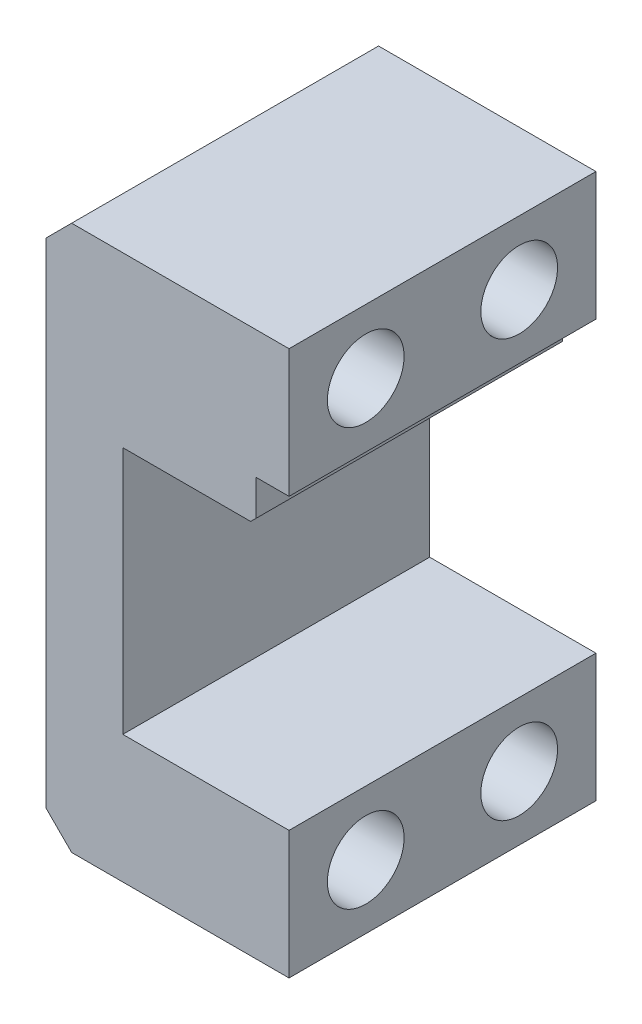
ISO-10303-21;
HEADER;
FILE_DESCRIPTION(('STEP AP214'),'2;1');
FILE_NAME('part.step','',(''),(''),'','','');
FILE_SCHEMA(('AUTOMOTIVE_DESIGN { 1 0 10303 214 1 1 1 1 }'));
ENDSEC;
DATA;
#1=APPLICATION_CONTEXT('core data for automotive mechanical design processes');
#2=APPLICATION_PROTOCOL_DEFINITION('international standard','automotive_design',2000,#1);
#3=PRODUCT_CONTEXT('',#1,'mechanical');
#4=PRODUCT('Part','Part','',(#3));
#5=PRODUCT_RELATED_PRODUCT_CATEGORY('part','',(#4));
#6=PRODUCT_DEFINITION_FORMATION('','',#4);
#7=PRODUCT_DEFINITION_CONTEXT('part definition',#1,'design');
#8=PRODUCT_DEFINITION('design','',#6,#7);
#9=PRODUCT_DEFINITION_SHAPE('','',#8);
#10=(LENGTH_UNIT() NAMED_UNIT(*) SI_UNIT(.MILLI.,.METRE.));
#11=(NAMED_UNIT(*) PLANE_ANGLE_UNIT() SI_UNIT($,.RADIAN.));
#12=(NAMED_UNIT(*) SI_UNIT($,.STERADIAN.) SOLID_ANGLE_UNIT());
#13=UNCERTAINTY_MEASURE_WITH_UNIT(LENGTH_MEASURE(1.E-05),#10,'distance_accuracy_value','');
#14=(GEOMETRIC_REPRESENTATION_CONTEXT(3) GLOBAL_UNCERTAINTY_ASSIGNED_CONTEXT((#13)) GLOBAL_UNIT_ASSIGNED_CONTEXT((#10,
#11,#12)) REPRESENTATION_CONTEXT('',''));
#15=CARTESIAN_POINT('',(0.,0.,0.));
#16=DIRECTION('',(0.,0.,1.));
#17=DIRECTION('',(1.,0.,0.));
#18=AXIS2_PLACEMENT_3D('',#15,#16,#17);
#19=CARTESIAN_POINT('',(9.5,0.,12.));
#20=DIRECTION('',(0.,1.,0.));
#21=DIRECTION('',(-1.,0.,0.));
#22=AXIS2_PLACEMENT_3D('',#19,#20,#21);
#23=PLANE('',#22);
#24=DIRECTION('',(1.,0.,0.));
#25=VECTOR('',#24,1.);
#26=CARTESIAN_POINT('',(9.5,0.,12.));
#27=LINE('',#26,#25);
#28=CARTESIAN_POINT('',(1.,0.,12.));
#29=VERTEX_POINT('',#28);
#30=CARTESIAN_POINT('',(9.5,0.,12.));
#31=VERTEX_POINT('',#30);
#32=EDGE_CURVE('E142',#29,#31,#27,.T.);
#33=ORIENTED_EDGE('',*,*,#32,.F.);
#34=DIRECTION('',(0.,0.,-1.));
#35=VECTOR('',#34,1.);
#36=CARTESIAN_POINT('',(1.,0.,12.));
#37=LINE('',#36,#35);
#38=CARTESIAN_POINT('',(1.,0.,0.));
#39=VERTEX_POINT('',#38);
#40=EDGE_CURVE('E180',#29,#39,#37,.T.);
#41=ORIENTED_EDGE('',*,*,#40,.T.);
#42=DIRECTION('',(1.,0.,0.));
#43=VECTOR('',#42,1.);
#44=CARTESIAN_POINT('',(9.5,0.,0.));
#45=LINE('',#44,#43);
#46=CARTESIAN_POINT('',(9.5,0.,0.));
#47=VERTEX_POINT('',#46);
#48=EDGE_CURVE('E164',#39,#47,#45,.T.);
#49=ORIENTED_EDGE('',*,*,#48,.T.);
#50=DIRECTION('',(0.,0.,-1.));
#51=VECTOR('',#50,1.);
#52=CARTESIAN_POINT('',(9.5,0.,12.));
#53=LINE('',#52,#51);
#54=EDGE_CURVE('E157',#31,#47,#53,.T.);
#55=ORIENTED_EDGE('',*,*,#54,.F.);
#56=EDGE_LOOP('',(#33,#41,#49,#55));
#57=FACE_BOUND('',#56,.T.);
#58=ADVANCED_FACE('F34',(#57),#23,.F.);
#59=CARTESIAN_POINT('',(9.5,5.,12.));
#60=DIRECTION('',(-1.,0.,0.));
#61=DIRECTION('',(0.,-1.,0.));
#62=AXIS2_PLACEMENT_3D('',#59,#60,#61);
#63=PLANE('',#62);
#64=CARTESIAN_POINT('',(9.5,2.5,3.));
#65=DIRECTION('',(-1.,0.,0.));
#66=DIRECTION('',(0.,0.,1.));
#67=AXIS2_PLACEMENT_3D('',#64,#65,#66);
#68=CIRCLE('',#67,1.5);
#69=CARTESIAN_POINT('',(9.5,2.5,4.5));
#70=VERTEX_POINT('',#69);
#71=EDGE_CURVE('E351',#70,#70,#68,.T.);
#72=ORIENTED_EDGE('',*,*,#71,.T.);
#73=EDGE_LOOP('',(#72));
#74=FACE_BOUND('',#73,.T.);
#75=CARTESIAN_POINT('',(9.5,2.5,9.));
#76=DIRECTION('',(-1.,0.,0.));
#77=DIRECTION('',(0.,0.,1.));
#78=AXIS2_PLACEMENT_3D('',#75,#76,#77);
#79=CIRCLE('',#78,1.5);
#80=CARTESIAN_POINT('',(9.5,2.5,10.5));
#81=VERTEX_POINT('',#80);
#82=EDGE_CURVE('E346',#81,#81,#79,.T.);
#83=ORIENTED_EDGE('',*,*,#82,.T.);
#84=EDGE_LOOP('',(#83));
#85=FACE_BOUND('',#84,.T.);
#86=DIRECTION('',(0.,1.,0.));
#87=VECTOR('',#86,1.);
#88=CARTESIAN_POINT('',(9.5,5.,0.));
#89=LINE('',#88,#87);
#90=CARTESIAN_POINT('',(9.5,5.,0.));
#91=VERTEX_POINT('',#90);
#92=EDGE_CURVE('E241',#47,#91,#89,.T.);
#93=ORIENTED_EDGE('',*,*,#92,.T.);
#94=DIRECTION('',(0.,0.,-1.));
#95=VECTOR('',#94,1.);
#96=CARTESIAN_POINT('',(9.5,5.,12.));
#97=LINE('',#96,#95);
#98=CARTESIAN_POINT('',(9.5,5.,12.));
#99=VERTEX_POINT('',#98);
#100=EDGE_CURVE('E159',#99,#91,#97,.T.);
#101=ORIENTED_EDGE('',*,*,#100,.F.);
#102=DIRECTION('',(0.,1.,0.));
#103=VECTOR('',#102,1.);
#104=CARTESIAN_POINT('',(9.5,5.,12.));
#105=LINE('',#104,#103);
#106=EDGE_CURVE('E145',#31,#99,#105,.T.);
#107=ORIENTED_EDGE('',*,*,#106,.F.);
#108=ORIENTED_EDGE('',*,*,#54,.T.);
#109=EDGE_LOOP('',(#93,#101,#107,#108));
#110=FACE_BOUND('',#109,.T.);
#111=ADVANCED_FACE('F156',(#74,#85,#110),#63,.F.);
#112=CARTESIAN_POINT('',(3.,5.,12.));
#113=DIRECTION('',(0.,-1.,0.));
#114=DIRECTION('',(1.,0.,0.));
#115=AXIS2_PLACEMENT_3D('',#112,#113,#114);
#116=PLANE('',#115);
#117=DIRECTION('',(-1.,0.,0.));
#118=VECTOR('',#117,1.);
#119=CARTESIAN_POINT('',(3.,5.,0.));
#120=LINE('',#119,#118);
#121=CARTESIAN_POINT('',(3.,5.,0.));
#122=VERTEX_POINT('',#121);
#123=EDGE_CURVE('E243',#91,#122,#120,.T.);
#124=ORIENTED_EDGE('',*,*,#123,.T.);
#125=DIRECTION('',(0.,0.,-1.));
#126=VECTOR('',#125,1.);
#127=CARTESIAN_POINT('',(3.,5.,12.));
#128=LINE('',#127,#126);
#129=CARTESIAN_POINT('',(3.,5.,12.));
#130=VERTEX_POINT('',#129);
#131=EDGE_CURVE('E171',#130,#122,#128,.T.);
#132=ORIENTED_EDGE('',*,*,#131,.F.);
#133=DIRECTION('',(-1.,0.,0.));
#134=VECTOR('',#133,1.);
#135=CARTESIAN_POINT('',(3.,5.,12.));
#136=LINE('',#135,#134);
#137=EDGE_CURVE('E161',#99,#130,#136,.T.);
#138=ORIENTED_EDGE('',*,*,#137,.F.);
#139=ORIENTED_EDGE('',*,*,#100,.T.);
#140=EDGE_LOOP('',(#124,#132,#138,#139));
#141=FACE_BOUND('',#140,.T.);
#142=ADVANCED_FACE('F320',(#141),#116,.F.);
#143=CARTESIAN_POINT('',(3.,14.71,12.));
#144=DIRECTION('',(-1.,0.,0.));
#145=DIRECTION('',(0.,-1.,0.));
#146=AXIS2_PLACEMENT_3D('',#143,#144,#145);
#147=PLANE('',#146);
#148=DIRECTION('',(0.,1.,0.));
#149=VECTOR('',#148,1.);
#150=CARTESIAN_POINT('',(3.,14.71,0.));
#151=LINE('',#150,#149);
#152=CARTESIAN_POINT('',(3.,14.71,0.));
#153=VERTEX_POINT('',#152);
#154=EDGE_CURVE('E245',#122,#153,#151,.T.);
#155=ORIENTED_EDGE('',*,*,#154,.T.);
#156=DIRECTION('',(0.,0.,-1.));
#157=VECTOR('',#156,1.);
#158=CARTESIAN_POINT('',(3.,14.71,12.));
#159=LINE('',#158,#157);
#160=CARTESIAN_POINT('',(3.,14.71,12.));
#161=VERTEX_POINT('',#160);
#162=EDGE_CURVE('E267',#161,#153,#159,.T.);
#163=ORIENTED_EDGE('',*,*,#162,.F.);
#164=DIRECTION('',(0.,1.,0.));
#165=VECTOR('',#164,1.);
#166=CARTESIAN_POINT('',(3.,14.71,12.));
#167=LINE('',#166,#165);
#168=EDGE_CURVE('E228',#130,#161,#167,.T.);
#169=ORIENTED_EDGE('',*,*,#168,.F.);
#170=ORIENTED_EDGE('',*,*,#131,.T.);
#171=EDGE_LOOP('',(#155,#163,#169,#170));
#172=FACE_BOUND('',#171,.T.);
#173=ADVANCED_FACE('F274',(#172),#147,.F.);
#174=CARTESIAN_POINT('',(8.2,14.71,12.));
#175=DIRECTION('',(0.,1.,0.));
#176=DIRECTION('',(-1.,0.,0.));
#177=AXIS2_PLACEMENT_3D('',#174,#175,#176);
#178=PLANE('',#177);
#179=DIRECTION('',(1.,0.,0.));
#180=VECTOR('',#179,1.);
#181=CARTESIAN_POINT('',(8.2,14.71,0.));
#182=LINE('',#181,#180);
#183=CARTESIAN_POINT('',(8.,14.71,0.));
#184=VERTEX_POINT('',#183);
#185=EDGE_CURVE('E247',#153,#184,#182,.T.);
#186=ORIENTED_EDGE('',*,*,#185,.T.);
#187=DIRECTION('',(0.,0.,1.));
#188=VECTOR('',#187,1.);
#189=CARTESIAN_POINT('',(8.,14.71,12.));
#190=LINE('',#189,#188);
#191=CARTESIAN_POINT('',(8.,14.71,12.));
#192=VERTEX_POINT('',#191);
#193=EDGE_CURVE('E176',#184,#192,#190,.T.);
#194=ORIENTED_EDGE('',*,*,#193,.T.);
#195=DIRECTION('',(1.,0.,0.));
#196=VECTOR('',#195,1.);
#197=CARTESIAN_POINT('',(8.2,14.71,12.));
#198=LINE('',#197,#196);
#199=EDGE_CURVE('E230',#161,#192,#198,.T.);
#200=ORIENTED_EDGE('',*,*,#199,.F.);
#201=ORIENTED_EDGE('',*,*,#162,.T.);
#202=EDGE_LOOP('',(#186,#194,#200,#201));
#203=FACE_BOUND('',#202,.T.);
#204=ADVANCED_FACE('F284',(#203),#178,.F.);
#205=CARTESIAN_POINT('',(8.2,16.31,12.));
#206=DIRECTION('',(-1.,0.,0.));
#207=DIRECTION('',(0.,-1.,0.));
#208=AXIS2_PLACEMENT_3D('',#205,#206,#207);
#209=PLANE('',#208);
#210=DIRECTION('',(0.,1.,0.));
#211=VECTOR('',#210,1.);
#212=CARTESIAN_POINT('',(8.2,16.31,12.));
#213=LINE('',#212,#211);
#214=CARTESIAN_POINT('',(8.2,14.91,12.));
#215=VERTEX_POINT('',#214);
#216=CARTESIAN_POINT('',(8.2,16.31,12.));
#217=VERTEX_POINT('',#216);
#218=EDGE_CURVE('E233',#215,#217,#213,.T.);
#219=ORIENTED_EDGE('',*,*,#218,.F.);
#220=DIRECTION('',(0.,0.,-1.));
#221=VECTOR('',#220,1.);
#222=CARTESIAN_POINT('',(8.2,14.91,12.));
#223=LINE('',#222,#221);
#224=CARTESIAN_POINT('',(8.2,14.91,0.));
#225=VERTEX_POINT('',#224);
#226=EDGE_CURVE('E166',#215,#225,#223,.T.);
#227=ORIENTED_EDGE('',*,*,#226,.T.);
#228=DIRECTION('',(0.,1.,0.));
#229=VECTOR('',#228,1.);
#230=CARTESIAN_POINT('',(8.2,16.31,0.));
#231=LINE('',#230,#229);
#232=CARTESIAN_POINT('',(8.2,16.31,0.));
#233=VERTEX_POINT('',#232);
#234=EDGE_CURVE('E250',#225,#233,#231,.T.);
#235=ORIENTED_EDGE('',*,*,#234,.T.);
#236=DIRECTION('',(0.,0.,-1.));
#237=VECTOR('',#236,1.);
#238=CARTESIAN_POINT('',(8.2,16.31,12.));
#239=LINE('',#238,#237);
#240=EDGE_CURVE('E264',#217,#233,#239,.T.);
#241=ORIENTED_EDGE('',*,*,#240,.F.);
#242=EDGE_LOOP('',(#219,#227,#235,#241));
#243=FACE_BOUND('',#242,.T.);
#244=ADVANCED_FACE('F293',(#243),#209,.F.);
#245=CARTESIAN_POINT('',(9.5,16.31,12.));
#246=DIRECTION('',(0.,1.,0.));
#247=DIRECTION('',(0.,0.,1.));
#248=AXIS2_PLACEMENT_3D('',#245,#246,#247);
#249=PLANE('',#248);
#250=DIRECTION('',(1.,0.,0.));
#251=VECTOR('',#250,1.);
#252=CARTESIAN_POINT('',(9.5,16.31,0.));
#253=LINE('',#252,#251);
#254=CARTESIAN_POINT('',(9.5,16.31,0.));
#255=VERTEX_POINT('',#254);
#256=EDGE_CURVE('E252',#233,#255,#253,.T.);
#257=ORIENTED_EDGE('',*,*,#256,.T.);
#258=DIRECTION('',(0.,0.,-1.));
#259=VECTOR('',#258,1.);
#260=CARTESIAN_POINT('',(9.5,16.31,12.));
#261=LINE('',#260,#259);
#262=CARTESIAN_POINT('',(9.5,16.31,12.));
#263=VERTEX_POINT('',#262);
#264=EDGE_CURVE('E261',#263,#255,#261,.T.);
#265=ORIENTED_EDGE('',*,*,#264,.F.);
#266=DIRECTION('',(1.,0.,0.));
#267=VECTOR('',#266,1.);
#268=CARTESIAN_POINT('',(9.5,16.31,12.));
#269=LINE('',#268,#267);
#270=EDGE_CURVE('E235',#217,#263,#269,.T.);
#271=ORIENTED_EDGE('',*,*,#270,.F.);
#272=ORIENTED_EDGE('',*,*,#240,.T.);
#273=EDGE_LOOP('',(#257,#265,#271,#272));
#274=FACE_BOUND('',#273,.T.);
#275=ADVANCED_FACE('F298',(#274),#249,.F.);
#276=CARTESIAN_POINT('',(9.5,21.31,12.));
#277=DIRECTION('',(-1.,0.,0.));
#278=DIRECTION('',(0.,0.,1.));
#279=AXIS2_PLACEMENT_3D('',#276,#277,#278);
#280=PLANE('',#279);
#281=CARTESIAN_POINT('',(9.5,18.81,9.));
#282=DIRECTION('',(-1.,0.,0.));
#283=DIRECTION('',(0.,0.,1.));
#284=AXIS2_PLACEMENT_3D('',#281,#282,#283);
#285=CIRCLE('',#284,1.5);
#286=CARTESIAN_POINT('',(9.5,18.81,10.5));
#287=VERTEX_POINT('',#286);
#288=EDGE_CURVE('E219',#287,#287,#285,.T.);
#289=ORIENTED_EDGE('',*,*,#288,.T.);
#290=EDGE_LOOP('',(#289));
#291=FACE_BOUND('',#290,.T.);
#292=CARTESIAN_POINT('',(9.5,18.81,3.));
#293=DIRECTION('',(-1.,0.,0.));
#294=DIRECTION('',(0.,0.,1.));
#295=AXIS2_PLACEMENT_3D('',#292,#293,#294);
#296=CIRCLE('',#295,1.5);
#297=CARTESIAN_POINT('',(9.5,18.81,4.5));
#298=VERTEX_POINT('',#297);
#299=EDGE_CURVE('E218',#298,#298,#296,.T.);
#300=ORIENTED_EDGE('',*,*,#299,.T.);
#301=EDGE_LOOP('',(#300));
#302=FACE_BOUND('',#301,.T.);
#303=DIRECTION('',(0.,1.,0.));
#304=VECTOR('',#303,1.);
#305=CARTESIAN_POINT('',(9.5,21.31,0.));
#306=LINE('',#305,#304);
#307=CARTESIAN_POINT('',(9.5,21.31,0.));
#308=VERTEX_POINT('',#307);
#309=EDGE_CURVE('E254',#255,#308,#306,.T.);
#310=ORIENTED_EDGE('',*,*,#309,.T.);
#311=DIRECTION('',(0.,0.,-1.));
#312=VECTOR('',#311,1.);
#313=CARTESIAN_POINT('',(9.5,21.31,12.));
#314=LINE('',#313,#312);
#315=CARTESIAN_POINT('',(9.5,21.31,12.));
#316=VERTEX_POINT('',#315);
#317=EDGE_CURVE('E208',#316,#308,#314,.T.);
#318=ORIENTED_EDGE('',*,*,#317,.F.);
#319=DIRECTION('',(0.,1.,0.));
#320=VECTOR('',#319,1.);
#321=CARTESIAN_POINT('',(9.5,21.31,12.));
#322=LINE('',#321,#320);
#323=EDGE_CURVE('E237',#263,#316,#322,.T.);
#324=ORIENTED_EDGE('',*,*,#323,.F.);
#325=ORIENTED_EDGE('',*,*,#264,.T.);
#326=EDGE_LOOP('',(#310,#318,#324,#325));
#327=FACE_BOUND('',#326,.T.);
#328=ADVANCED_FACE('F302',(#291,#302,#327),#280,.F.);
#329=CARTESIAN_POINT('',(0.,21.31,12.));
#330=DIRECTION('',(0.,-1.,0.));
#331=DIRECTION('',(0.,0.,-1.));
#332=AXIS2_PLACEMENT_3D('',#329,#330,#331);
#333=PLANE('',#332);
#334=DIRECTION('',(-1.,0.,0.));
#335=VECTOR('',#334,1.);
#336=CARTESIAN_POINT('',(0.,21.31,0.));
#337=LINE('',#336,#335);
#338=CARTESIAN_POINT('',(1.00000000000001,21.31,0.));
#339=VERTEX_POINT('',#338);
#340=EDGE_CURVE('E256',#308,#339,#337,.T.);
#341=ORIENTED_EDGE('',*,*,#340,.T.);
#342=DIRECTION('',(0.,0.,1.));
#343=VECTOR('',#342,1.);
#344=CARTESIAN_POINT('',(1.00000000000001,21.31,12.));
#345=LINE('',#344,#343);
#346=CARTESIAN_POINT('',(1.00000000000001,21.31,12.));
#347=VERTEX_POINT('',#346);
#348=EDGE_CURVE('E11',#339,#347,#345,.T.);
#349=ORIENTED_EDGE('',*,*,#348,.T.);
#350=DIRECTION('',(-1.,0.,0.));
#351=VECTOR('',#350,1.);
#352=CARTESIAN_POINT('',(0.,21.31,12.));
#353=LINE('',#352,#351);
#354=EDGE_CURVE('E201',#316,#347,#353,.T.);
#355=ORIENTED_EDGE('',*,*,#354,.F.);
#356=ORIENTED_EDGE('',*,*,#317,.T.);
#357=EDGE_LOOP('',(#341,#349,#355,#356));
#358=FACE_BOUND('',#357,.T.);
#359=ADVANCED_FACE('F305',(#358),#333,.F.);
#360=CARTESIAN_POINT('',(0.,0.,12.));
#361=DIRECTION('',(1.,0.,0.));
#362=DIRECTION('',(0.,0.,-1.));
#363=AXIS2_PLACEMENT_3D('',#360,#361,#362);
#364=PLANE('',#363);
#365=DIRECTION('',(0.,-1.,0.));
#366=VECTOR('',#365,1.);
#367=CARTESIAN_POINT('',(0.,0.,0.));
#368=LINE('',#367,#366);
#369=CARTESIAN_POINT('',(0.,20.31,0.));
#370=VERTEX_POINT('',#369);
#371=CARTESIAN_POINT('',(0.,1.00000000000001,0.));
#372=VERTEX_POINT('',#371);
#373=EDGE_CURVE('E152',#370,#372,#368,.T.);
#374=ORIENTED_EDGE('',*,*,#373,.T.);
#375=DIRECTION('',(0.,0.,1.));
#376=VECTOR('',#375,1.);
#377=CARTESIAN_POINT('',(0.,1.00000000000001,12.));
#378=LINE('',#377,#376);
#379=CARTESIAN_POINT('',(0.,1.00000000000001,3.));
#380=VERTEX_POINT('',#379);
#381=EDGE_CURVE('E196',#372,#380,#378,.T.);
#382=ORIENTED_EDGE('',*,*,#381,.T.);
#383=CARTESIAN_POINT('',(0.,2.5,3.));
#384=DIRECTION('',(-1.,0.,0.));
#385=DIRECTION('',(0.,0.,1.));
#386=AXIS2_PLACEMENT_3D('',#383,#384,#385);
#387=CIRCLE('',#386,1.5);
#388=EDGE_CURVE('E343',#380,#380,#387,.T.);
#389=ORIENTED_EDGE('',*,*,#388,.F.);
#390=DIRECTION('',(0.,0.,1.));
#391=VECTOR('',#390,1.);
#392=CARTESIAN_POINT('',(0.,1.00000000000001,12.));
#393=LINE('',#392,#391);
#394=CARTESIAN_POINT('',(0.,1.00000000000001,9.));
#395=VERTEX_POINT('',#394);
#396=EDGE_CURVE('E194',#380,#395,#393,.T.);
#397=ORIENTED_EDGE('',*,*,#396,.T.);
#398=CARTESIAN_POINT('',(0.,2.5,9.));
#399=DIRECTION('',(-1.,0.,0.));
#400=DIRECTION('',(0.,0.,1.));
#401=AXIS2_PLACEMENT_3D('',#398,#399,#400);
#402=CIRCLE('',#401,1.5);
#403=EDGE_CURVE('E341',#395,#395,#402,.T.);
#404=ORIENTED_EDGE('',*,*,#403,.F.);
#405=DIRECTION('',(0.,0.,1.));
#406=VECTOR('',#405,1.);
#407=CARTESIAN_POINT('',(0.,1.00000000000001,12.));
#408=LINE('',#407,#406);
#409=CARTESIAN_POINT('',(0.,1.00000000000001,12.));
#410=VERTEX_POINT('',#409);
#411=EDGE_CURVE('E55',#395,#410,#408,.T.);
#412=ORIENTED_EDGE('',*,*,#411,.T.);
#413=DIRECTION('',(0.,-1.,0.));
#414=VECTOR('',#413,1.);
#415=CARTESIAN_POINT('',(0.,0.,12.));
#416=LINE('',#415,#414);
#417=CARTESIAN_POINT('',(0.,20.31,12.));
#418=VERTEX_POINT('',#417);
#419=EDGE_CURVE('E200',#418,#410,#416,.T.);
#420=ORIENTED_EDGE('',*,*,#419,.F.);
#421=DIRECTION('',(0.,0.,-1.));
#422=VECTOR('',#421,1.);
#423=CARTESIAN_POINT('',(0.,20.31,12.));
#424=LINE('',#423,#422);
#425=CARTESIAN_POINT('',(0.,20.31,9.));
#426=VERTEX_POINT('',#425);
#427=EDGE_CURVE('E190',#418,#426,#424,.T.);
#428=ORIENTED_EDGE('',*,*,#427,.T.);
#429=CARTESIAN_POINT('',(0.,18.81,9.));
#430=DIRECTION('',(-1.,0.,0.));
#431=DIRECTION('',(0.,0.,1.));
#432=AXIS2_PLACEMENT_3D('',#429,#430,#431);
#433=CIRCLE('',#432,1.5);
#434=EDGE_CURVE('E215',#426,#426,#433,.T.);
#435=ORIENTED_EDGE('',*,*,#434,.F.);
#436=DIRECTION('',(0.,0.,-1.));
#437=VECTOR('',#436,1.);
#438=CARTESIAN_POINT('',(0.,20.31,12.));
#439=LINE('',#438,#437);
#440=CARTESIAN_POINT('',(0.,20.31,3.));
#441=VERTEX_POINT('',#440);
#442=EDGE_CURVE('E188',#426,#441,#439,.T.);
#443=ORIENTED_EDGE('',*,*,#442,.T.);
#444=CARTESIAN_POINT('',(0.,18.81,3.));
#445=DIRECTION('',(-1.,0.,0.));
#446=DIRECTION('',(0.,0.,1.));
#447=AXIS2_PLACEMENT_3D('',#444,#445,#446);
#448=CIRCLE('',#447,1.5);
#449=EDGE_CURVE('E214',#441,#441,#448,.T.);
#450=ORIENTED_EDGE('',*,*,#449,.F.);
#451=DIRECTION('',(0.,0.,-1.));
#452=VECTOR('',#451,1.);
#453=CARTESIAN_POINT('',(0.,20.31,12.));
#454=LINE('',#453,#452);
#455=EDGE_CURVE('E186',#441,#370,#454,.T.);
#456=ORIENTED_EDGE('',*,*,#455,.T.);
#457=EDGE_LOOP('',(#374,#382,#389,#397,#404,#412,#420,#428,#435,#443,#450,#456));
#458=FACE_BOUND('',#457,.T.);
#459=ADVANCED_FACE('F205',(#458),#364,.F.);
#460=CARTESIAN_POINT('',(0.,0.,12.));
#461=DIRECTION('',(0.,0.,-1.));
#462=DIRECTION('',(-1.,0.,0.));
#463=AXIS2_PLACEMENT_3D('',#460,#461,#462);
#464=PLANE('',#463);
#465=ORIENTED_EDGE('',*,*,#419,.T.);
#466=DIRECTION('',(-0.707106781186546,0.707106781186549,0.));
#467=VECTOR('',#466,1.);
#468=CARTESIAN_POINT('',(1.,0.,12.));
#469=LINE('',#468,#467);
#470=EDGE_CURVE('E42',#410,#29,#469,.F.);
#471=ORIENTED_EDGE('',*,*,#470,.T.);
#472=ORIENTED_EDGE('',*,*,#32,.T.);
#473=ORIENTED_EDGE('',*,*,#106,.T.);
#474=ORIENTED_EDGE('',*,*,#137,.T.);
#475=ORIENTED_EDGE('',*,*,#168,.T.);
#476=ORIENTED_EDGE('',*,*,#199,.T.);
#477=DIRECTION('',(-0.707106781186554,-0.707106781186541,0.));
#478=VECTOR('',#477,1.);
#479=CARTESIAN_POINT('',(8.2,14.91,12.));
#480=LINE('',#479,#478);
#481=EDGE_CURVE('E178',#192,#215,#480,.F.);
#482=ORIENTED_EDGE('',*,*,#481,.T.);
#483=ORIENTED_EDGE('',*,*,#218,.T.);
#484=ORIENTED_EDGE('',*,*,#270,.T.);
#485=ORIENTED_EDGE('',*,*,#323,.T.);
#486=ORIENTED_EDGE('',*,*,#354,.T.);
#487=DIRECTION('',(0.707106781186548,0.707106781186548,0.));
#488=VECTOR('',#487,1.);
#489=CARTESIAN_POINT('',(0.,20.31,12.));
#490=LINE('',#489,#488);
#491=EDGE_CURVE('E198',#347,#418,#490,.F.);
#492=ORIENTED_EDGE('',*,*,#491,.T.);
#493=EDGE_LOOP('',(#465,#471,#472,#473,#474,#475,#476,#482,#483,#484,#485,#486,#492));
#494=FACE_BOUND('',#493,.T.);
#495=ADVANCED_FACE('F144',(#494),#464,.F.);
#496=CARTESIAN_POINT('',(0.,0.,0.));
#497=DIRECTION('',(0.,0.,-1.));
#498=DIRECTION('',(-1.,0.,0.));
#499=AXIS2_PLACEMENT_3D('',#496,#497,#498);
#500=PLANE('',#499);
#501=ORIENTED_EDGE('',*,*,#48,.F.);
#502=DIRECTION('',(0.707106781186546,-0.707106781186549,0.));
#503=VECTOR('',#502,1.);
#504=CARTESIAN_POINT('',(0.500000000000004,0.500000000000002,0.));
#505=LINE('',#504,#503);
#506=EDGE_CURVE('E184',#39,#372,#505,.F.);
#507=ORIENTED_EDGE('',*,*,#506,.T.);
#508=ORIENTED_EDGE('',*,*,#373,.F.);
#509=DIRECTION('',(-0.707106781186548,-0.707106781186548,0.));
#510=VECTOR('',#509,1.);
#511=CARTESIAN_POINT('',(-10.155,10.155,0.));
#512=LINE('',#511,#510);
#513=EDGE_CURVE('E182',#370,#339,#512,.F.);
#514=ORIENTED_EDGE('',*,*,#513,.T.);
#515=ORIENTED_EDGE('',*,*,#340,.F.);
#516=ORIENTED_EDGE('',*,*,#309,.F.);
#517=ORIENTED_EDGE('',*,*,#256,.F.);
#518=ORIENTED_EDGE('',*,*,#234,.F.);
#519=DIRECTION('',(0.707106781186554,0.707106781186541,0.));
#520=VECTOR('',#519,1.);
#521=CARTESIAN_POINT('',(-3.35500000000007,3.35500000000013,0.));
#522=LINE('',#521,#520);
#523=EDGE_CURVE('E169',#225,#184,#522,.F.);
#524=ORIENTED_EDGE('',*,*,#523,.T.);
#525=ORIENTED_EDGE('',*,*,#185,.F.);
#526=ORIENTED_EDGE('',*,*,#154,.F.);
#527=ORIENTED_EDGE('',*,*,#123,.F.);
#528=ORIENTED_EDGE('',*,*,#92,.F.);
#529=EDGE_LOOP('',(#501,#507,#508,#514,#515,#516,#517,#518,#524,#525,#526,#527,#528));
#530=FACE_BOUND('',#529,.T.);
#531=ADVANCED_FACE('F280',(#530),#500,.T.);
#532=CARTESIAN_POINT('',(8.2,14.91,12.));
#533=DIRECTION('',(-0.707106781186541,0.707106781186554,0.));
#534=DIRECTION('',(0.,0.,-1.));
#535=AXIS2_PLACEMENT_3D('',#532,#533,#534);
#536=PLANE('',#535);
#537=ORIENTED_EDGE('',*,*,#481,.F.);
#538=ORIENTED_EDGE('',*,*,#193,.F.);
#539=ORIENTED_EDGE('',*,*,#523,.F.);
#540=ORIENTED_EDGE('',*,*,#226,.F.);
#541=EDGE_LOOP('',(#537,#538,#539,#540));
#542=FACE_BOUND('',#541,.T.);
#543=ADVANCED_FACE('F288',(#542),#536,.F.);
#544=CARTESIAN_POINT('',(9.5,18.81,3.));
#545=DIRECTION('',(-1.,0.,0.));
#546=DIRECTION('',(0.,0.,1.));
#547=AXIS2_PLACEMENT_3D('',#544,#545,#546);
#548=CYLINDRICAL_SURFACE('',#547,1.5);
#549=ORIENTED_EDGE('',*,*,#299,.F.);
#550=EDGE_LOOP('',(#549));
#551=FACE_BOUND('',#550,.T.);
#552=ORIENTED_EDGE('',*,*,#449,.T.);
#553=EDGE_LOOP('',(#552));
#554=FACE_BOUND('',#553,.T.);
#555=ADVANCED_FACE('F217',(#551,#554),#548,.F.);
#556=CARTESIAN_POINT('',(9.5,2.5,9.));
#557=DIRECTION('',(-1.,0.,0.));
#558=DIRECTION('',(0.,0.,1.));
#559=AXIS2_PLACEMENT_3D('',#556,#557,#558);
#560=CYLINDRICAL_SURFACE('',#559,1.5);
#561=ORIENTED_EDGE('',*,*,#82,.F.);
#562=EDGE_LOOP('',(#561));
#563=FACE_BOUND('',#562,.T.);
#564=ORIENTED_EDGE('',*,*,#403,.T.);
#565=EDGE_LOOP('',(#564));
#566=FACE_BOUND('',#565,.T.);
#567=ADVANCED_FACE('F345',(#563,#566),#560,.F.);
#568=CARTESIAN_POINT('',(9.5,2.5,3.));
#569=DIRECTION('',(-1.,0.,0.));
#570=DIRECTION('',(0.,0.,1.));
#571=AXIS2_PLACEMENT_3D('',#568,#569,#570);
#572=CYLINDRICAL_SURFACE('',#571,1.5);
#573=ORIENTED_EDGE('',*,*,#71,.F.);
#574=EDGE_LOOP('',(#573));
#575=FACE_BOUND('',#574,.T.);
#576=ORIENTED_EDGE('',*,*,#388,.T.);
#577=EDGE_LOOP('',(#576));
#578=FACE_BOUND('',#577,.T.);
#579=ADVANCED_FACE('F334',(#575,#578),#572,.F.);
#580=CARTESIAN_POINT('',(9.5,18.81,9.));
#581=DIRECTION('',(-1.,0.,0.));
#582=DIRECTION('',(0.,0.,1.));
#583=AXIS2_PLACEMENT_3D('',#580,#581,#582);
#584=CYLINDRICAL_SURFACE('',#583,1.5);
#585=ORIENTED_EDGE('',*,*,#288,.F.);
#586=EDGE_LOOP('',(#585));
#587=FACE_BOUND('',#586,.T.);
#588=ORIENTED_EDGE('',*,*,#434,.T.);
#589=EDGE_LOOP('',(#588));
#590=FACE_BOUND('',#589,.T.);
#591=ADVANCED_FACE('F328',(#587,#590),#584,.F.);
#592=CARTESIAN_POINT('',(1.,0.,12.));
#593=DIRECTION('',(0.707106781186549,0.707106781186546,0.));
#594=DIRECTION('',(0.,0.,-1.));
#595=AXIS2_PLACEMENT_3D('',#592,#593,#594);
#596=PLANE('',#595);
#597=ORIENTED_EDGE('',*,*,#396,.F.);
#598=ORIENTED_EDGE('',*,*,#381,.F.);
#599=ORIENTED_EDGE('',*,*,#506,.F.);
#600=ORIENTED_EDGE('',*,*,#40,.F.);
#601=ORIENTED_EDGE('',*,*,#470,.F.);
#602=ORIENTED_EDGE('',*,*,#411,.F.);
#603=EDGE_LOOP('',(#597,#598,#599,#600,#601,#602));
#604=FACE_BOUND('',#603,.T.);
#605=ADVANCED_FACE('F326',(#604),#596,.F.);
#606=CARTESIAN_POINT('',(0.,20.31,12.));
#607=DIRECTION('',(0.707106781186547,-0.707106781186547,0.));
#608=DIRECTION('',(0.,0.,-1.));
#609=AXIS2_PLACEMENT_3D('',#606,#607,#608);
#610=PLANE('',#609);
#611=ORIENTED_EDGE('',*,*,#491,.F.);
#612=ORIENTED_EDGE('',*,*,#348,.F.);
#613=ORIENTED_EDGE('',*,*,#513,.F.);
#614=ORIENTED_EDGE('',*,*,#455,.F.);
#615=ORIENTED_EDGE('',*,*,#442,.F.);
#616=ORIENTED_EDGE('',*,*,#427,.F.);
#617=EDGE_LOOP('',(#611,#612,#613,#614,#615,#616));
#618=FACE_BOUND('',#617,.T.);
#619=ADVANCED_FACE('F36',(#618),#610,.F.);
#620=CLOSED_SHELL('',(#58,#111,#142,#173,#204,#244,#275,#328,#359,#459,#495,#531,#543,#555,#567,
#579,#591,#605,#619));
#621=MANIFOLD_SOLID_BREP('B2',#620);
#622=ADVANCED_BREP_SHAPE_REPRESENTATION('',(#18,#621),#14);
#623=SHAPE_DEFINITION_REPRESENTATION(#9,#622);
ENDSEC;
END-ISO-10303-21;
